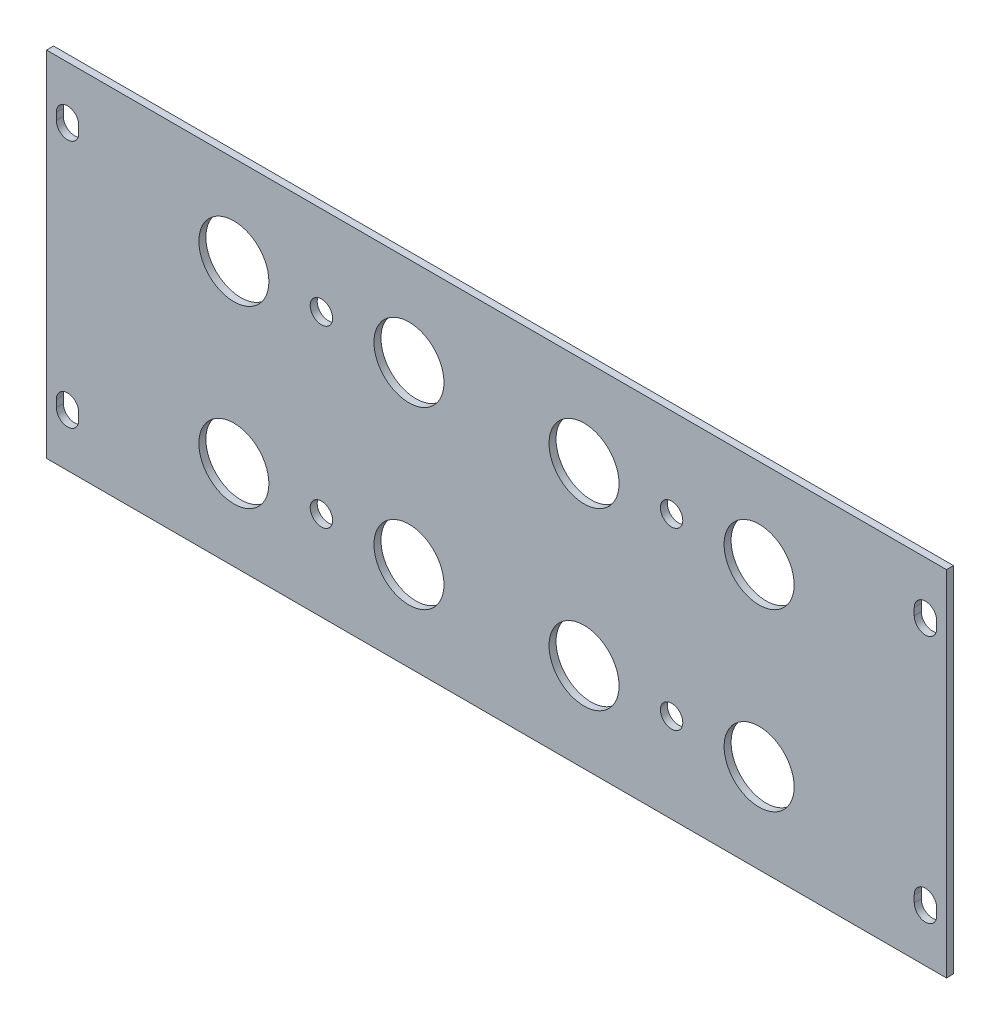
ISO-10303-21;
HEADER;
FILE_DESCRIPTION(('STEP AP214'),'2;1');
FILE_NAME('part.step','',(''),(''),'','','');
FILE_SCHEMA(('AUTOMOTIVE_DESIGN { 1 0 10303 214 1 1 1 1 }'));
ENDSEC;
DATA;
#1=APPLICATION_CONTEXT('core data for automotive mechanical design processes');
#2=APPLICATION_PROTOCOL_DEFINITION('international standard','automotive_design',2000,#1);
#3=PRODUCT_CONTEXT('',#1,'mechanical');
#4=PRODUCT('Part','Part','',(#3));
#5=PRODUCT_RELATED_PRODUCT_CATEGORY('part','',(#4));
#6=PRODUCT_DEFINITION_FORMATION('','',#4);
#7=PRODUCT_DEFINITION_CONTEXT('part definition',#1,'design');
#8=PRODUCT_DEFINITION('design','',#6,#7);
#9=PRODUCT_DEFINITION_SHAPE('','',#8);
#10=(LENGTH_UNIT() NAMED_UNIT(*) SI_UNIT(.MILLI.,.METRE.));
#11=(NAMED_UNIT(*) PLANE_ANGLE_UNIT() SI_UNIT($,.RADIAN.));
#12=(NAMED_UNIT(*) SI_UNIT($,.STERADIAN.) SOLID_ANGLE_UNIT());
#13=UNCERTAINTY_MEASURE_WITH_UNIT(LENGTH_MEASURE(1.E-05),#10,'distance_accuracy_value','');
#14=(GEOMETRIC_REPRESENTATION_CONTEXT(3) GLOBAL_UNCERTAINTY_ASSIGNED_CONTEXT((#13)) GLOBAL_UNIT_ASSIGNED_CONTEXT((#10,
#11,#12)) REPRESENTATION_CONTEXT('',''));
#15=CARTESIAN_POINT('',(0.,0.,0.));
#16=DIRECTION('',(0.,0.,1.));
#17=DIRECTION('',(1.,0.,0.));
#18=AXIS2_PLACEMENT_3D('',#15,#16,#17);
#19=CARTESIAN_POINT('',(64.25,0.,1.));
#20=DIRECTION('',(-1.,0.,0.));
#21=DIRECTION('',(0.,0.,1.));
#22=AXIS2_PLACEMENT_3D('',#19,#20,#21);
#23=PLANE('',#22);
#24=DIRECTION('',(0.,1.,0.));
#25=VECTOR('',#24,1.);
#26=CARTESIAN_POINT('',(64.25,0.,0.));
#27=LINE('',#26,#25);
#28=CARTESIAN_POINT('',(64.25,-25.25,0.));
#29=VERTEX_POINT('',#28);
#30=CARTESIAN_POINT('',(64.25,25.25,0.));
#31=VERTEX_POINT('',#30);
#32=EDGE_CURVE('E327',#29,#31,#27,.T.);
#33=ORIENTED_EDGE('',*,*,#32,.T.);
#34=DIRECTION('',(0.,0.,-1.));
#35=VECTOR('',#34,1.);
#36=CARTESIAN_POINT('',(64.25,25.25,1.));
#37=LINE('',#36,#35);
#38=CARTESIAN_POINT('',(64.25,25.25,1.));
#39=VERTEX_POINT('',#38);
#40=EDGE_CURVE('E11',#39,#31,#37,.T.);
#41=ORIENTED_EDGE('',*,*,#40,.F.);
#42=DIRECTION('',(0.,1.,0.));
#43=VECTOR('',#42,1.);
#44=CARTESIAN_POINT('',(64.25,0.,1.));
#45=LINE('',#44,#43);
#46=CARTESIAN_POINT('',(64.25,-25.25,1.));
#47=VERTEX_POINT('',#46);
#48=EDGE_CURVE('E197',#47,#39,#45,.T.);
#49=ORIENTED_EDGE('',*,*,#48,.F.);
#50=DIRECTION('',(0.,0.,-1.));
#51=VECTOR('',#50,1.);
#52=CARTESIAN_POINT('',(64.25,-25.25,1.));
#53=LINE('',#52,#51);
#54=EDGE_CURVE('E338',#47,#29,#53,.T.);
#55=ORIENTED_EDGE('',*,*,#54,.T.);
#56=EDGE_LOOP('',(#33,#41,#49,#55));
#57=FACE_BOUND('',#56,.T.);
#58=ADVANCED_FACE('F43',(#57),#23,.F.);
#59=CARTESIAN_POINT('',(0.,25.25,1.));
#60=DIRECTION('',(0.,-1.,0.));
#61=DIRECTION('',(0.,0.,-1.));
#62=AXIS2_PLACEMENT_3D('',#59,#60,#61);
#63=PLANE('',#62);
#64=DIRECTION('',(-1.,0.,0.));
#65=VECTOR('',#64,1.);
#66=CARTESIAN_POINT('',(0.,25.25,0.));
#67=LINE('',#66,#65);
#68=CARTESIAN_POINT('',(-64.25,25.25,0.));
#69=VERTEX_POINT('',#68);
#70=EDGE_CURVE('E203',#31,#69,#67,.T.);
#71=ORIENTED_EDGE('',*,*,#70,.T.);
#72=DIRECTION('',(0.,0.,-1.));
#73=VECTOR('',#72,1.);
#74=CARTESIAN_POINT('',(-64.25,25.25,1.));
#75=LINE('',#74,#73);
#76=CARTESIAN_POINT('',(-64.25,25.25,1.));
#77=VERTEX_POINT('',#76);
#78=EDGE_CURVE('E54',#77,#69,#75,.T.);
#79=ORIENTED_EDGE('',*,*,#78,.F.);
#80=DIRECTION('',(-1.,0.,0.));
#81=VECTOR('',#80,1.);
#82=CARTESIAN_POINT('',(0.,25.25,1.));
#83=LINE('',#82,#81);
#84=EDGE_CURVE('E191',#39,#77,#83,.T.);
#85=ORIENTED_EDGE('',*,*,#84,.F.);
#86=ORIENTED_EDGE('',*,*,#40,.T.);
#87=EDGE_LOOP('',(#71,#79,#85,#86));
#88=FACE_BOUND('',#87,.T.);
#89=ADVANCED_FACE('F202',(#88),#63,.F.);
#90=CARTESIAN_POINT('',(-64.25,0.,1.));
#91=DIRECTION('',(1.,0.,0.));
#92=DIRECTION('',(0.,0.,-1.));
#93=AXIS2_PLACEMENT_3D('',#90,#91,#92);
#94=PLANE('',#93);
#95=DIRECTION('',(0.,-1.,0.));
#96=VECTOR('',#95,1.);
#97=CARTESIAN_POINT('',(-64.25,0.,0.));
#98=LINE('',#97,#96);
#99=CARTESIAN_POINT('',(-64.25,-25.25,0.));
#100=VERTEX_POINT('',#99);
#101=EDGE_CURVE('E128',#69,#100,#98,.T.);
#102=ORIENTED_EDGE('',*,*,#101,.T.);
#103=DIRECTION('',(0.,0.,-1.));
#104=VECTOR('',#103,1.);
#105=CARTESIAN_POINT('',(-64.25,-25.25,1.));
#106=LINE('',#105,#104);
#107=CARTESIAN_POINT('',(-64.25,-25.25,1.));
#108=VERTEX_POINT('',#107);
#109=EDGE_CURVE('E205',#108,#100,#106,.T.);
#110=ORIENTED_EDGE('',*,*,#109,.F.);
#111=DIRECTION('',(0.,-1.,0.));
#112=VECTOR('',#111,1.);
#113=CARTESIAN_POINT('',(-64.25,0.,1.));
#114=LINE('',#113,#112);
#115=EDGE_CURVE('E195',#77,#108,#114,.T.);
#116=ORIENTED_EDGE('',*,*,#115,.F.);
#117=ORIENTED_EDGE('',*,*,#78,.T.);
#118=EDGE_LOOP('',(#102,#110,#116,#117));
#119=FACE_BOUND('',#118,.T.);
#120=ADVANCED_FACE('F207',(#119),#94,.F.);
#121=CARTESIAN_POINT('',(-61.25,18.25,1.));
#122=DIRECTION('',(0.,0.,-1.));
#123=DIRECTION('',(-1.,0.,0.));
#124=AXIS2_PLACEMENT_3D('',#121,#122,#123);
#125=CYLINDRICAL_SURFACE('',#124,1.6);
#126=CARTESIAN_POINT('',(-61.25,18.25,0.));
#127=DIRECTION('',(0.,0.,1.));
#128=DIRECTION('',(1.,0.,0.));
#129=AXIS2_PLACEMENT_3D('',#126,#127,#128);
#130=CIRCLE('',#129,1.6);
#131=CARTESIAN_POINT('',(-59.65,18.25,0.));
#132=VERTEX_POINT('',#131);
#133=CARTESIAN_POINT('',(-62.85,18.25,0.));
#134=VERTEX_POINT('',#133);
#135=EDGE_CURVE('E279',#132,#134,#130,.T.);
#136=ORIENTED_EDGE('',*,*,#135,.F.);
#137=DIRECTION('',(0.,0.,-1.));
#138=VECTOR('',#137,1.);
#139=CARTESIAN_POINT('',(-59.65,18.25,1.));
#140=LINE('',#139,#138);
#141=CARTESIAN_POINT('',(-59.65,18.25,1.));
#142=VERTEX_POINT('',#141);
#143=EDGE_CURVE('E341',#142,#132,#140,.T.);
#144=ORIENTED_EDGE('',*,*,#143,.F.);
#145=CARTESIAN_POINT('',(-61.25,18.25,1.));
#146=DIRECTION('',(0.,0.,1.));
#147=DIRECTION('',(1.,0.,0.));
#148=AXIS2_PLACEMENT_3D('',#145,#146,#147);
#149=CIRCLE('',#148,1.6);
#150=CARTESIAN_POINT('',(-62.85,18.25,1.));
#151=VERTEX_POINT('',#150);
#152=EDGE_CURVE('E448',#142,#151,#149,.T.);
#153=ORIENTED_EDGE('',*,*,#152,.T.);
#154=DIRECTION('',(0.,0.,-1.));
#155=VECTOR('',#154,1.);
#156=CARTESIAN_POINT('',(-62.85,18.25,1.));
#157=LINE('',#156,#155);
#158=EDGE_CURVE('E344',#151,#134,#157,.T.);
#159=ORIENTED_EDGE('',*,*,#158,.T.);
#160=EDGE_LOOP('',(#136,#144,#153,#159));
#161=FACE_BOUND('',#160,.T.);
#162=ADVANCED_FACE('F566',(#161),#125,.F.);
#163=CARTESIAN_POINT('',(-59.65,0.,1.));
#164=DIRECTION('',(-1.,0.,0.));
#165=DIRECTION('',(0.,0.,1.));
#166=AXIS2_PLACEMENT_3D('',#163,#164,#165);
#167=PLANE('',#166);
#168=DIRECTION('',(0.,1.,0.));
#169=VECTOR('',#168,1.);
#170=CARTESIAN_POINT('',(-59.65,0.,0.));
#171=LINE('',#170,#169);
#172=CARTESIAN_POINT('',(-59.65,17.25,0.));
#173=VERTEX_POINT('',#172);
#174=EDGE_CURVE('E283',#173,#132,#171,.T.);
#175=ORIENTED_EDGE('',*,*,#174,.F.);
#176=DIRECTION('',(0.,0.,-1.));
#177=VECTOR('',#176,1.);
#178=CARTESIAN_POINT('',(-59.65,17.25,1.));
#179=LINE('',#178,#177);
#180=CARTESIAN_POINT('',(-59.65,17.25,1.));
#181=VERTEX_POINT('',#180);
#182=EDGE_CURVE('E351',#181,#173,#179,.T.);
#183=ORIENTED_EDGE('',*,*,#182,.F.);
#184=DIRECTION('',(0.,1.,0.));
#185=VECTOR('',#184,1.);
#186=CARTESIAN_POINT('',(-59.65,0.,1.));
#187=LINE('',#186,#185);
#188=EDGE_CURVE('E452',#181,#142,#187,.T.);
#189=ORIENTED_EDGE('',*,*,#188,.T.);
#190=ORIENTED_EDGE('',*,*,#143,.T.);
#191=EDGE_LOOP('',(#175,#183,#189,#190));
#192=FACE_BOUND('',#191,.T.);
#193=ADVANCED_FACE('F562',(#192),#167,.T.);
#194=CARTESIAN_POINT('',(-61.25,17.25,1.));
#195=DIRECTION('',(0.,0.,-1.));
#196=DIRECTION('',(-1.,0.,0.));
#197=AXIS2_PLACEMENT_3D('',#194,#195,#196);
#198=CYLINDRICAL_SURFACE('',#197,1.6);
#199=CARTESIAN_POINT('',(-61.25,17.25,0.));
#200=DIRECTION('',(0.,0.,1.));
#201=DIRECTION('',(1.,0.,0.));
#202=AXIS2_PLACEMENT_3D('',#199,#200,#201);
#203=CIRCLE('',#202,1.6);
#204=CARTESIAN_POINT('',(-62.85,17.25,0.));
#205=VERTEX_POINT('',#204);
#206=EDGE_CURVE('E287',#205,#173,#203,.T.);
#207=ORIENTED_EDGE('',*,*,#206,.F.);
#208=DIRECTION('',(0.,0.,-1.));
#209=VECTOR('',#208,1.);
#210=CARTESIAN_POINT('',(-62.85,17.25,1.));
#211=LINE('',#210,#209);
#212=CARTESIAN_POINT('',(-62.85,17.25,1.));
#213=VERTEX_POINT('',#212);
#214=EDGE_CURVE('E347',#213,#205,#211,.T.);
#215=ORIENTED_EDGE('',*,*,#214,.F.);
#216=CARTESIAN_POINT('',(-61.25,17.25,1.));
#217=DIRECTION('',(0.,0.,1.));
#218=DIRECTION('',(1.,0.,0.));
#219=AXIS2_PLACEMENT_3D('',#216,#217,#218);
#220=CIRCLE('',#219,1.6);
#221=EDGE_CURVE('E456',#213,#181,#220,.T.);
#222=ORIENTED_EDGE('',*,*,#221,.T.);
#223=ORIENTED_EDGE('',*,*,#182,.T.);
#224=EDGE_LOOP('',(#207,#215,#222,#223));
#225=FACE_BOUND('',#224,.T.);
#226=ADVANCED_FACE('F558',(#225),#198,.F.);
#227=CARTESIAN_POINT('',(-61.25,-17.25,1.));
#228=DIRECTION('',(0.,0.,-1.));
#229=DIRECTION('',(-1.,0.,0.));
#230=AXIS2_PLACEMENT_3D('',#227,#228,#229);
#231=CYLINDRICAL_SURFACE('',#230,1.6);
#232=CARTESIAN_POINT('',(-61.25,-17.25,0.));
#233=DIRECTION('',(0.,0.,1.));
#234=DIRECTION('',(1.,0.,0.));
#235=AXIS2_PLACEMENT_3D('',#232,#233,#234);
#236=CIRCLE('',#235,1.6);
#237=CARTESIAN_POINT('',(-59.65,-17.25,0.));
#238=VERTEX_POINT('',#237);
#239=CARTESIAN_POINT('',(-62.85,-17.25,0.));
#240=VERTEX_POINT('',#239);
#241=EDGE_CURVE('E263',#238,#240,#236,.T.);
#242=ORIENTED_EDGE('',*,*,#241,.F.);
#243=DIRECTION('',(0.,0.,-1.));
#244=VECTOR('',#243,1.);
#245=CARTESIAN_POINT('',(-59.65,-17.25,1.));
#246=LINE('',#245,#244);
#247=CARTESIAN_POINT('',(-59.65,-17.25,1.));
#248=VERTEX_POINT('',#247);
#249=EDGE_CURVE('E348',#248,#238,#246,.T.);
#250=ORIENTED_EDGE('',*,*,#249,.F.);
#251=CARTESIAN_POINT('',(-61.25,-17.25,1.));
#252=DIRECTION('',(0.,0.,1.));
#253=DIRECTION('',(1.,0.,0.));
#254=AXIS2_PLACEMENT_3D('',#251,#252,#253);
#255=CIRCLE('',#254,1.6);
#256=CARTESIAN_POINT('',(-62.85,-17.25,1.));
#257=VERTEX_POINT('',#256);
#258=EDGE_CURVE('E432',#248,#257,#255,.T.);
#259=ORIENTED_EDGE('',*,*,#258,.T.);
#260=DIRECTION('',(0.,0.,-1.));
#261=VECTOR('',#260,1.);
#262=CARTESIAN_POINT('',(-62.85,-17.25,1.));
#263=LINE('',#262,#261);
#264=EDGE_CURVE('E356',#257,#240,#263,.T.);
#265=ORIENTED_EDGE('',*,*,#264,.T.);
#266=EDGE_LOOP('',(#242,#250,#259,#265));
#267=FACE_BOUND('',#266,.T.);
#268=ADVANCED_FACE('F561',(#267),#231,.F.);
#269=CARTESIAN_POINT('',(-59.65,0.,1.));
#270=DIRECTION('',(-1.,0.,0.));
#271=DIRECTION('',(0.,0.,1.));
#272=AXIS2_PLACEMENT_3D('',#269,#270,#271);
#273=PLANE('',#272);
#274=DIRECTION('',(0.,1.,0.));
#275=VECTOR('',#274,1.);
#276=CARTESIAN_POINT('',(-59.65,0.,0.));
#277=LINE('',#276,#275);
#278=CARTESIAN_POINT('',(-59.65,-18.25,0.));
#279=VERTEX_POINT('',#278);
#280=EDGE_CURVE('E267',#279,#238,#277,.T.);
#281=ORIENTED_EDGE('',*,*,#280,.F.);
#282=DIRECTION('',(0.,0.,-1.));
#283=VECTOR('',#282,1.);
#284=CARTESIAN_POINT('',(-59.65,-18.25,1.));
#285=LINE('',#284,#283);
#286=CARTESIAN_POINT('',(-59.65,-18.25,1.));
#287=VERTEX_POINT('',#286);
#288=EDGE_CURVE('E363',#287,#279,#285,.T.);
#289=ORIENTED_EDGE('',*,*,#288,.F.);
#290=DIRECTION('',(0.,1.,0.));
#291=VECTOR('',#290,1.);
#292=CARTESIAN_POINT('',(-59.65,0.,1.));
#293=LINE('',#292,#291);
#294=EDGE_CURVE('E436',#287,#248,#293,.T.);
#295=ORIENTED_EDGE('',*,*,#294,.T.);
#296=ORIENTED_EDGE('',*,*,#249,.T.);
#297=EDGE_LOOP('',(#281,#289,#295,#296));
#298=FACE_BOUND('',#297,.T.);
#299=ADVANCED_FACE('F579',(#298),#273,.T.);
#300=CARTESIAN_POINT('',(-61.25,-18.25,1.));
#301=DIRECTION('',(0.,0.,-1.));
#302=DIRECTION('',(-1.,0.,0.));
#303=AXIS2_PLACEMENT_3D('',#300,#301,#302);
#304=CYLINDRICAL_SURFACE('',#303,1.6);
#305=CARTESIAN_POINT('',(-61.25,-18.25,0.));
#306=DIRECTION('',(0.,0.,1.));
#307=DIRECTION('',(1.,0.,0.));
#308=AXIS2_PLACEMENT_3D('',#305,#306,#307);
#309=CIRCLE('',#308,1.6);
#310=CARTESIAN_POINT('',(-62.85,-18.25,0.));
#311=VERTEX_POINT('',#310);
#312=EDGE_CURVE('E271',#311,#279,#309,.T.);
#313=ORIENTED_EDGE('',*,*,#312,.F.);
#314=DIRECTION('',(0.,0.,-1.));
#315=VECTOR('',#314,1.);
#316=CARTESIAN_POINT('',(-62.85,-18.25,1.));
#317=LINE('',#316,#315);
#318=CARTESIAN_POINT('',(-62.85,-18.25,1.));
#319=VERTEX_POINT('',#318);
#320=EDGE_CURVE('E359',#319,#311,#317,.T.);
#321=ORIENTED_EDGE('',*,*,#320,.F.);
#322=CARTESIAN_POINT('',(-61.25,-18.25,1.));
#323=DIRECTION('',(0.,0.,1.));
#324=DIRECTION('',(1.,0.,0.));
#325=AXIS2_PLACEMENT_3D('',#322,#323,#324);
#326=CIRCLE('',#325,1.6);
#327=EDGE_CURVE('E440',#319,#287,#326,.T.);
#328=ORIENTED_EDGE('',*,*,#327,.T.);
#329=ORIENTED_EDGE('',*,*,#288,.T.);
#330=EDGE_LOOP('',(#313,#321,#328,#329));
#331=FACE_BOUND('',#330,.T.);
#332=ADVANCED_FACE('F575',(#331),#304,.F.);
#333=CARTESIAN_POINT('',(61.25,17.25,1.));
#334=DIRECTION('',(0.,0.,-1.));
#335=DIRECTION('',(-1.,0.,0.));
#336=AXIS2_PLACEMENT_3D('',#333,#334,#335);
#337=CYLINDRICAL_SURFACE('',#336,1.6);
#338=CARTESIAN_POINT('',(61.25,17.25,0.));
#339=DIRECTION('',(0.,0.,1.));
#340=DIRECTION('',(1.,0.,0.));
#341=AXIS2_PLACEMENT_3D('',#338,#339,#340);
#342=CIRCLE('',#341,1.6);
#343=CARTESIAN_POINT('',(59.65,17.25,0.));
#344=VERTEX_POINT('',#343);
#345=CARTESIAN_POINT('',(62.85,17.25,0.));
#346=VERTEX_POINT('',#345);
#347=EDGE_CURVE('E247',#344,#346,#342,.T.);
#348=ORIENTED_EDGE('',*,*,#347,.F.);
#349=DIRECTION('',(0.,0.,-1.));
#350=VECTOR('',#349,1.);
#351=CARTESIAN_POINT('',(59.65,17.25,1.));
#352=LINE('',#351,#350);
#353=CARTESIAN_POINT('',(59.65,17.25,1.));
#354=VERTEX_POINT('',#353);
#355=EDGE_CURVE('E360',#354,#344,#352,.T.);
#356=ORIENTED_EDGE('',*,*,#355,.F.);
#357=CARTESIAN_POINT('',(61.25,17.25,1.));
#358=DIRECTION('',(0.,0.,1.));
#359=DIRECTION('',(1.,0.,0.));
#360=AXIS2_PLACEMENT_3D('',#357,#358,#359);
#361=CIRCLE('',#360,1.6);
#362=CARTESIAN_POINT('',(62.85,17.25,1.));
#363=VERTEX_POINT('',#362);
#364=EDGE_CURVE('E413',#354,#363,#361,.T.);
#365=ORIENTED_EDGE('',*,*,#364,.T.);
#366=DIRECTION('',(0.,0.,-1.));
#367=VECTOR('',#366,1.);
#368=CARTESIAN_POINT('',(62.85,17.25,1.));
#369=LINE('',#368,#367);
#370=EDGE_CURVE('E368',#363,#346,#369,.T.);
#371=ORIENTED_EDGE('',*,*,#370,.T.);
#372=EDGE_LOOP('',(#348,#356,#365,#371));
#373=FACE_BOUND('',#372,.T.);
#374=ADVANCED_FACE('F578',(#373),#337,.F.);
#375=CARTESIAN_POINT('',(59.65,0.,1.));
#376=DIRECTION('',(1.,0.,0.));
#377=DIRECTION('',(0.,0.,-1.));
#378=AXIS2_PLACEMENT_3D('',#375,#376,#377);
#379=PLANE('',#378);
#380=DIRECTION('',(0.,-1.,0.));
#381=VECTOR('',#380,1.);
#382=CARTESIAN_POINT('',(59.65,0.,0.));
#383=LINE('',#382,#381);
#384=CARTESIAN_POINT('',(59.65,18.25,0.));
#385=VERTEX_POINT('',#384);
#386=EDGE_CURVE('E251',#385,#344,#383,.T.);
#387=ORIENTED_EDGE('',*,*,#386,.F.);
#388=DIRECTION('',(0.,0.,-1.));
#389=VECTOR('',#388,1.);
#390=CARTESIAN_POINT('',(59.65,18.25,1.));
#391=LINE('',#390,#389);
#392=CARTESIAN_POINT('',(59.65,18.25,1.));
#393=VERTEX_POINT('',#392);
#394=EDGE_CURVE('E374',#393,#385,#391,.T.);
#395=ORIENTED_EDGE('',*,*,#394,.F.);
#396=DIRECTION('',(0.,-1.,0.));
#397=VECTOR('',#396,1.);
#398=CARTESIAN_POINT('',(59.65,0.,1.));
#399=LINE('',#398,#397);
#400=EDGE_CURVE('E417',#393,#354,#399,.T.);
#401=ORIENTED_EDGE('',*,*,#400,.T.);
#402=ORIENTED_EDGE('',*,*,#355,.T.);
#403=EDGE_LOOP('',(#387,#395,#401,#402));
#404=FACE_BOUND('',#403,.T.);
#405=ADVANCED_FACE('F593',(#404),#379,.T.);
#406=CARTESIAN_POINT('',(61.25,18.25,1.));
#407=DIRECTION('',(0.,0.,-1.));
#408=DIRECTION('',(-1.,0.,0.));
#409=AXIS2_PLACEMENT_3D('',#406,#407,#408);
#410=CYLINDRICAL_SURFACE('',#409,1.6);
#411=CARTESIAN_POINT('',(61.25,18.25,0.));
#412=DIRECTION('',(0.,0.,1.));
#413=DIRECTION('',(1.,0.,0.));
#414=AXIS2_PLACEMENT_3D('',#411,#412,#413);
#415=CIRCLE('',#414,1.6);
#416=CARTESIAN_POINT('',(62.85,18.25,0.));
#417=VERTEX_POINT('',#416);
#418=EDGE_CURVE('E255',#417,#385,#415,.T.);
#419=ORIENTED_EDGE('',*,*,#418,.F.);
#420=DIRECTION('',(0.,0.,-1.));
#421=VECTOR('',#420,1.);
#422=CARTESIAN_POINT('',(62.85,18.25,1.));
#423=LINE('',#422,#421);
#424=CARTESIAN_POINT('',(62.85,18.25,1.));
#425=VERTEX_POINT('',#424);
#426=EDGE_CURVE('E371',#425,#417,#423,.T.);
#427=ORIENTED_EDGE('',*,*,#426,.F.);
#428=CARTESIAN_POINT('',(61.25,18.25,1.));
#429=DIRECTION('',(0.,0.,1.));
#430=DIRECTION('',(1.,0.,0.));
#431=AXIS2_PLACEMENT_3D('',#428,#429,#430);
#432=CIRCLE('',#431,1.6);
#433=EDGE_CURVE('E424',#425,#393,#432,.T.);
#434=ORIENTED_EDGE('',*,*,#433,.T.);
#435=ORIENTED_EDGE('',*,*,#394,.T.);
#436=EDGE_LOOP('',(#419,#427,#434,#435));
#437=FACE_BOUND('',#436,.T.);
#438=ADVANCED_FACE('F590',(#437),#410,.F.);
#439=CARTESIAN_POINT('',(61.25,-17.25,1.));
#440=DIRECTION('',(0.,0.,-1.));
#441=DIRECTION('',(-1.,0.,0.));
#442=AXIS2_PLACEMENT_3D('',#439,#440,#441);
#443=CYLINDRICAL_SURFACE('',#442,1.6);
#444=CARTESIAN_POINT('',(61.25,-17.25,0.));
#445=DIRECTION('',(0.,0.,1.));
#446=DIRECTION('',(1.,0.,0.));
#447=AXIS2_PLACEMENT_3D('',#444,#445,#446);
#448=CIRCLE('',#447,1.6);
#449=CARTESIAN_POINT('',(62.85,-17.25,0.));
#450=VERTEX_POINT('',#449);
#451=CARTESIAN_POINT('',(59.65,-17.25,0.));
#452=VERTEX_POINT('',#451);
#453=EDGE_CURVE('E231',#450,#452,#448,.T.);
#454=ORIENTED_EDGE('',*,*,#453,.F.);
#455=DIRECTION('',(0.,0.,-1.));
#456=VECTOR('',#455,1.);
#457=CARTESIAN_POINT('',(62.85,-17.25,1.));
#458=LINE('',#457,#456);
#459=CARTESIAN_POINT('',(62.85,-17.25,1.));
#460=VERTEX_POINT('',#459);
#461=EDGE_CURVE('E47',#460,#450,#458,.T.);
#462=ORIENTED_EDGE('',*,*,#461,.F.);
#463=CARTESIAN_POINT('',(61.25,-17.25,1.));
#464=DIRECTION('',(0.,0.,1.));
#465=DIRECTION('',(1.,0.,0.));
#466=AXIS2_PLACEMENT_3D('',#463,#464,#465);
#467=CIRCLE('',#466,1.6);
#468=CARTESIAN_POINT('',(59.65,-17.25,1.));
#469=VERTEX_POINT('',#468);
#470=EDGE_CURVE('E649',#460,#469,#467,.T.);
#471=ORIENTED_EDGE('',*,*,#470,.T.);
#472=DIRECTION('',(0.,0.,-1.));
#473=VECTOR('',#472,1.);
#474=CARTESIAN_POINT('',(59.65,-17.25,1.));
#475=LINE('',#474,#473);
#476=EDGE_CURVE('E211',#469,#452,#475,.T.);
#477=ORIENTED_EDGE('',*,*,#476,.T.);
#478=EDGE_LOOP('',(#454,#462,#471,#477));
#479=FACE_BOUND('',#478,.T.);
#480=ADVANCED_FACE('F395',(#479),#443,.F.);
#481=CARTESIAN_POINT('',(62.85,0.,1.));
#482=DIRECTION('',(-1.,0.,0.));
#483=DIRECTION('',(0.,0.,1.));
#484=AXIS2_PLACEMENT_3D('',#481,#482,#483);
#485=PLANE('',#484);
#486=DIRECTION('',(0.,1.,0.));
#487=VECTOR('',#486,1.);
#488=CARTESIAN_POINT('',(62.85,0.,0.));
#489=LINE('',#488,#487);
#490=CARTESIAN_POINT('',(62.85,-18.25,0.));
#491=VERTEX_POINT('',#490);
#492=EDGE_CURVE('E235',#491,#450,#489,.T.);
#493=ORIENTED_EDGE('',*,*,#492,.F.);
#494=DIRECTION('',(0.,0.,-1.));
#495=VECTOR('',#494,1.);
#496=CARTESIAN_POINT('',(62.85,-18.25,1.));
#497=LINE('',#496,#495);
#498=CARTESIAN_POINT('',(62.85,-18.25,1.));
#499=VERTEX_POINT('',#498);
#500=EDGE_CURVE('E383',#499,#491,#497,.T.);
#501=ORIENTED_EDGE('',*,*,#500,.F.);
#502=DIRECTION('',(0.,1.,0.));
#503=VECTOR('',#502,1.);
#504=CARTESIAN_POINT('',(62.85,0.,1.));
#505=LINE('',#504,#503);
#506=EDGE_CURVE('E394',#499,#460,#505,.T.);
#507=ORIENTED_EDGE('',*,*,#506,.T.);
#508=ORIENTED_EDGE('',*,*,#461,.T.);
#509=EDGE_LOOP('',(#493,#501,#507,#508));
#510=FACE_BOUND('',#509,.T.);
#511=ADVANCED_FACE('F392',(#510),#485,.T.);
#512=CARTESIAN_POINT('',(61.25,-18.25,1.));
#513=DIRECTION('',(0.,0.,-1.));
#514=DIRECTION('',(-1.,0.,0.));
#515=AXIS2_PLACEMENT_3D('',#512,#513,#514);
#516=CYLINDRICAL_SURFACE('',#515,1.6);
#517=CARTESIAN_POINT('',(61.25,-18.25,0.));
#518=DIRECTION('',(0.,0.,1.));
#519=DIRECTION('',(1.,0.,0.));
#520=AXIS2_PLACEMENT_3D('',#517,#518,#519);
#521=CIRCLE('',#520,1.6);
#522=CARTESIAN_POINT('',(59.65,-18.25,0.));
#523=VERTEX_POINT('',#522);
#524=EDGE_CURVE('E239',#523,#491,#521,.T.);
#525=ORIENTED_EDGE('',*,*,#524,.F.);
#526=DIRECTION('',(0.,0.,-1.));
#527=VECTOR('',#526,1.);
#528=CARTESIAN_POINT('',(59.65,-18.25,1.));
#529=LINE('',#528,#527);
#530=CARTESIAN_POINT('',(59.65,-18.25,1.));
#531=VERTEX_POINT('',#530);
#532=EDGE_CURVE('E381',#531,#523,#529,.T.);
#533=ORIENTED_EDGE('',*,*,#532,.F.);
#534=CARTESIAN_POINT('',(61.25,-18.25,1.));
#535=DIRECTION('',(0.,0.,1.));
#536=DIRECTION('',(1.,0.,0.));
#537=AXIS2_PLACEMENT_3D('',#534,#535,#536);
#538=CIRCLE('',#537,1.6);
#539=EDGE_CURVE('E402',#531,#499,#538,.T.);
#540=ORIENTED_EDGE('',*,*,#539,.T.);
#541=ORIENTED_EDGE('',*,*,#500,.T.);
#542=EDGE_LOOP('',(#525,#533,#540,#541));
#543=FACE_BOUND('',#542,.T.);
#544=ADVANCED_FACE('F400',(#543),#516,.F.);
#545=CARTESIAN_POINT('',(-37.5,12.5,1.));
#546=DIRECTION('',(0.,0.,-1.));
#547=DIRECTION('',(-1.,0.,0.));
#548=AXIS2_PLACEMENT_3D('',#545,#546,#547);
#549=CYLINDRICAL_SURFACE('',#548,5.);
#550=CARTESIAN_POINT('',(-37.5,12.5,1.));
#551=DIRECTION('',(0.,0.,1.));
#552=DIRECTION('',(1.,0.,0.));
#553=AXIS2_PLACEMENT_3D('',#550,#551,#552);
#554=CIRCLE('',#553,5.);
#555=CARTESIAN_POINT('',(-32.5,12.5,1.));
#556=VERTEX_POINT('',#555);
#557=EDGE_CURVE('E492',#556,#556,#554,.T.);
#558=ORIENTED_EDGE('',*,*,#557,.T.);
#559=EDGE_LOOP('',(#558));
#560=FACE_BOUND('',#559,.T.);
#561=CARTESIAN_POINT('',(-37.5,12.5,0.));
#562=DIRECTION('',(0.,0.,1.));
#563=DIRECTION('',(1.,0.,0.));
#564=AXIS2_PLACEMENT_3D('',#561,#562,#563);
#565=CIRCLE('',#564,5.);
#566=CARTESIAN_POINT('',(-32.5,12.5,0.));
#567=VERTEX_POINT('',#566);
#568=EDGE_CURVE('E323',#567,#567,#565,.T.);
#569=ORIENTED_EDGE('',*,*,#568,.F.);
#570=EDGE_LOOP('',(#569));
#571=FACE_BOUND('',#570,.T.);
#572=ADVANCED_FACE('F498',(#560,#571),#549,.F.);
#573=CARTESIAN_POINT('',(-12.5,12.5,1.));
#574=DIRECTION('',(0.,0.,-1.));
#575=DIRECTION('',(-1.,0.,0.));
#576=AXIS2_PLACEMENT_3D('',#573,#574,#575);
#577=CYLINDRICAL_SURFACE('',#576,5.);
#578=CARTESIAN_POINT('',(-12.5,12.5,1.));
#579=DIRECTION('',(0.,0.,1.));
#580=DIRECTION('',(1.,0.,0.));
#581=AXIS2_PLACEMENT_3D('',#578,#579,#580);
#582=CIRCLE('',#581,5.);
#583=CARTESIAN_POINT('',(-7.5,12.5,1.));
#584=VERTEX_POINT('',#583);
#585=EDGE_CURVE('E488',#584,#584,#582,.T.);
#586=ORIENTED_EDGE('',*,*,#585,.T.);
#587=EDGE_LOOP('',(#586));
#588=FACE_BOUND('',#587,.T.);
#589=CARTESIAN_POINT('',(-12.5,12.5,0.));
#590=DIRECTION('',(0.,0.,1.));
#591=DIRECTION('',(1.,0.,0.));
#592=AXIS2_PLACEMENT_3D('',#589,#590,#591);
#593=CIRCLE('',#592,5.);
#594=CARTESIAN_POINT('',(-7.5,12.5,0.));
#595=VERTEX_POINT('',#594);
#596=EDGE_CURVE('E319',#595,#595,#593,.T.);
#597=ORIENTED_EDGE('',*,*,#596,.F.);
#598=EDGE_LOOP('',(#597));
#599=FACE_BOUND('',#598,.T.);
#600=ADVANCED_FACE('F525',(#588,#599),#577,.F.);
#601=CARTESIAN_POINT('',(12.5,12.5,1.));
#602=DIRECTION('',(0.,0.,-1.));
#603=DIRECTION('',(-1.,0.,0.));
#604=AXIS2_PLACEMENT_3D('',#601,#602,#603);
#605=CYLINDRICAL_SURFACE('',#604,5.);
#606=CARTESIAN_POINT('',(12.5,12.5,1.));
#607=DIRECTION('',(0.,0.,1.));
#608=DIRECTION('',(1.,0.,0.));
#609=AXIS2_PLACEMENT_3D('',#606,#607,#608);
#610=CIRCLE('',#609,5.);
#611=CARTESIAN_POINT('',(17.5,12.5,1.));
#612=VERTEX_POINT('',#611);
#613=EDGE_CURVE('E484',#612,#612,#610,.T.);
#614=ORIENTED_EDGE('',*,*,#613,.T.);
#615=EDGE_LOOP('',(#614));
#616=FACE_BOUND('',#615,.T.);
#617=CARTESIAN_POINT('',(12.5,12.5,0.));
#618=DIRECTION('',(0.,0.,1.));
#619=DIRECTION('',(1.,0.,0.));
#620=AXIS2_PLACEMENT_3D('',#617,#618,#619);
#621=CIRCLE('',#620,5.);
#622=CARTESIAN_POINT('',(17.5,12.5,0.));
#623=VERTEX_POINT('',#622);
#624=EDGE_CURVE('E315',#623,#623,#621,.T.);
#625=ORIENTED_EDGE('',*,*,#624,.F.);
#626=EDGE_LOOP('',(#625));
#627=FACE_BOUND('',#626,.T.);
#628=ADVANCED_FACE('F528',(#616,#627),#605,.F.);
#629=CARTESIAN_POINT('',(37.5,12.5,1.));
#630=DIRECTION('',(0.,0.,-1.));
#631=DIRECTION('',(-1.,0.,0.));
#632=AXIS2_PLACEMENT_3D('',#629,#630,#631);
#633=CYLINDRICAL_SURFACE('',#632,5.);
#634=CARTESIAN_POINT('',(37.5,12.5,1.));
#635=DIRECTION('',(0.,0.,1.));
#636=DIRECTION('',(1.,0.,0.));
#637=AXIS2_PLACEMENT_3D('',#634,#635,#636);
#638=CIRCLE('',#637,5.);
#639=CARTESIAN_POINT('',(42.5,12.5,1.));
#640=VERTEX_POINT('',#639);
#641=EDGE_CURVE('E480',#640,#640,#638,.T.);
#642=ORIENTED_EDGE('',*,*,#641,.T.);
#643=EDGE_LOOP('',(#642));
#644=FACE_BOUND('',#643,.T.);
#645=CARTESIAN_POINT('',(37.5,12.5,0.));
#646=DIRECTION('',(0.,0.,1.));
#647=DIRECTION('',(1.,0.,0.));
#648=AXIS2_PLACEMENT_3D('',#645,#646,#647);
#649=CIRCLE('',#648,5.);
#650=CARTESIAN_POINT('',(42.5,12.5,0.));
#651=VERTEX_POINT('',#650);
#652=EDGE_CURVE('E311',#651,#651,#649,.T.);
#653=ORIENTED_EDGE('',*,*,#652,.F.);
#654=EDGE_LOOP('',(#653));
#655=FACE_BOUND('',#654,.T.);
#656=ADVANCED_FACE('F532',(#644,#655),#633,.F.);
#657=CARTESIAN_POINT('',(37.5,-12.5,1.));
#658=DIRECTION('',(0.,0.,-1.));
#659=DIRECTION('',(-1.,0.,0.));
#660=AXIS2_PLACEMENT_3D('',#657,#658,#659);
#661=CYLINDRICAL_SURFACE('',#660,5.);
#662=CARTESIAN_POINT('',(37.5,-12.5,1.));
#663=DIRECTION('',(0.,0.,1.));
#664=DIRECTION('',(1.,0.,0.));
#665=AXIS2_PLACEMENT_3D('',#662,#663,#664);
#666=CIRCLE('',#665,5.);
#667=CARTESIAN_POINT('',(42.5,-12.5,1.));
#668=VERTEX_POINT('',#667);
#669=EDGE_CURVE('E476',#668,#668,#666,.T.);
#670=ORIENTED_EDGE('',*,*,#669,.T.);
#671=EDGE_LOOP('',(#670));
#672=FACE_BOUND('',#671,.T.);
#673=CARTESIAN_POINT('',(37.5,-12.5,0.));
#674=DIRECTION('',(0.,0.,1.));
#675=DIRECTION('',(1.,0.,0.));
#676=AXIS2_PLACEMENT_3D('',#673,#674,#675);
#677=CIRCLE('',#676,5.);
#678=CARTESIAN_POINT('',(42.5,-12.5,0.));
#679=VERTEX_POINT('',#678);
#680=EDGE_CURVE('E307',#679,#679,#677,.T.);
#681=ORIENTED_EDGE('',*,*,#680,.F.);
#682=EDGE_LOOP('',(#681));
#683=FACE_BOUND('',#682,.T.);
#684=ADVANCED_FACE('F536',(#672,#683),#661,.F.);
#685=CARTESIAN_POINT('',(-12.5,-12.5,1.));
#686=DIRECTION('',(0.,0.,-1.));
#687=DIRECTION('',(-1.,0.,0.));
#688=AXIS2_PLACEMENT_3D('',#685,#686,#687);
#689=CYLINDRICAL_SURFACE('',#688,5.);
#690=CARTESIAN_POINT('',(-12.5,-12.5,1.));
#691=DIRECTION('',(0.,0.,1.));
#692=DIRECTION('',(1.,0.,0.));
#693=AXIS2_PLACEMENT_3D('',#690,#691,#692);
#694=CIRCLE('',#693,5.);
#695=CARTESIAN_POINT('',(-7.5,-12.5,1.));
#696=VERTEX_POINT('',#695);
#697=EDGE_CURVE('E472',#696,#696,#694,.T.);
#698=ORIENTED_EDGE('',*,*,#697,.T.);
#699=EDGE_LOOP('',(#698));
#700=FACE_BOUND('',#699,.T.);
#701=CARTESIAN_POINT('',(-12.5,-12.5,0.));
#702=DIRECTION('',(0.,0.,1.));
#703=DIRECTION('',(1.,0.,0.));
#704=AXIS2_PLACEMENT_3D('',#701,#702,#703);
#705=CIRCLE('',#704,5.);
#706=CARTESIAN_POINT('',(-7.5,-12.5,0.));
#707=VERTEX_POINT('',#706);
#708=EDGE_CURVE('E303',#707,#707,#705,.T.);
#709=ORIENTED_EDGE('',*,*,#708,.F.);
#710=EDGE_LOOP('',(#709));
#711=FACE_BOUND('',#710,.T.);
#712=ADVANCED_FACE('F540',(#700,#711),#689,.F.);
#713=CARTESIAN_POINT('',(-37.5,-12.5,1.));
#714=DIRECTION('',(0.,0.,-1.));
#715=DIRECTION('',(-1.,0.,0.));
#716=AXIS2_PLACEMENT_3D('',#713,#714,#715);
#717=CYLINDRICAL_SURFACE('',#716,5.);
#718=CARTESIAN_POINT('',(-37.5,-12.5,1.));
#719=DIRECTION('',(0.,0.,1.));
#720=DIRECTION('',(1.,0.,0.));
#721=AXIS2_PLACEMENT_3D('',#718,#719,#720);
#722=CIRCLE('',#721,5.);
#723=CARTESIAN_POINT('',(-32.5,-12.5,1.));
#724=VERTEX_POINT('',#723);
#725=EDGE_CURVE('E468',#724,#724,#722,.T.);
#726=ORIENTED_EDGE('',*,*,#725,.T.);
#727=EDGE_LOOP('',(#726));
#728=FACE_BOUND('',#727,.T.);
#729=CARTESIAN_POINT('',(-37.5,-12.5,0.));
#730=DIRECTION('',(0.,0.,1.));
#731=DIRECTION('',(1.,0.,0.));
#732=AXIS2_PLACEMENT_3D('',#729,#730,#731);
#733=CIRCLE('',#732,5.);
#734=CARTESIAN_POINT('',(-32.5,-12.5,0.));
#735=VERTEX_POINT('',#734);
#736=EDGE_CURVE('E299',#735,#735,#733,.T.);
#737=ORIENTED_EDGE('',*,*,#736,.F.);
#738=EDGE_LOOP('',(#737));
#739=FACE_BOUND('',#738,.T.);
#740=ADVANCED_FACE('F544',(#728,#739),#717,.F.);
#741=CARTESIAN_POINT('',(12.5,-12.5,1.));
#742=DIRECTION('',(0.,0.,-1.));
#743=DIRECTION('',(-1.,0.,0.));
#744=AXIS2_PLACEMENT_3D('',#741,#742,#743);
#745=CYLINDRICAL_SURFACE('',#744,5.);
#746=CARTESIAN_POINT('',(12.5,-12.5,1.));
#747=DIRECTION('',(0.,0.,1.));
#748=DIRECTION('',(1.,0.,0.));
#749=AXIS2_PLACEMENT_3D('',#746,#747,#748);
#750=CIRCLE('',#749,5.);
#751=CARTESIAN_POINT('',(17.5,-12.5,1.));
#752=VERTEX_POINT('',#751);
#753=EDGE_CURVE('E464',#752,#752,#750,.T.);
#754=ORIENTED_EDGE('',*,*,#753,.T.);
#755=EDGE_LOOP('',(#754));
#756=FACE_BOUND('',#755,.T.);
#757=CARTESIAN_POINT('',(12.5,-12.5,0.));
#758=DIRECTION('',(0.,0.,1.));
#759=DIRECTION('',(1.,0.,0.));
#760=AXIS2_PLACEMENT_3D('',#757,#758,#759);
#761=CIRCLE('',#760,5.);
#762=CARTESIAN_POINT('',(17.5,-12.5,0.));
#763=VERTEX_POINT('',#762);
#764=EDGE_CURVE('E295',#763,#763,#761,.T.);
#765=ORIENTED_EDGE('',*,*,#764,.F.);
#766=EDGE_LOOP('',(#765));
#767=FACE_BOUND('',#766,.T.);
#768=ADVANCED_FACE('F548',(#756,#767),#745,.F.);
#769=CARTESIAN_POINT('',(-62.85,0.,1.));
#770=DIRECTION('',(1.,0.,0.));
#771=DIRECTION('',(0.,0.,-1.));
#772=AXIS2_PLACEMENT_3D('',#769,#770,#771);
#773=PLANE('',#772);
#774=DIRECTION('',(0.,-1.,0.));
#775=VECTOR('',#774,1.);
#776=CARTESIAN_POINT('',(-62.85,0.,0.));
#777=LINE('',#776,#775);
#778=EDGE_CURVE('E291',#134,#205,#777,.T.);
#779=ORIENTED_EDGE('',*,*,#778,.F.);
#780=ORIENTED_EDGE('',*,*,#158,.F.);
#781=DIRECTION('',(0.,-1.,0.));
#782=VECTOR('',#781,1.);
#783=CARTESIAN_POINT('',(-62.85,0.,1.));
#784=LINE('',#783,#782);
#785=EDGE_CURVE('E460',#151,#213,#784,.T.);
#786=ORIENTED_EDGE('',*,*,#785,.T.);
#787=ORIENTED_EDGE('',*,*,#214,.T.);
#788=EDGE_LOOP('',(#779,#780,#786,#787));
#789=FACE_BOUND('',#788,.T.);
#790=ADVANCED_FACE('F552',(#789),#773,.T.);
#791=CARTESIAN_POINT('',(-62.85,0.,1.));
#792=DIRECTION('',(1.,0.,0.));
#793=DIRECTION('',(0.,0.,-1.));
#794=AXIS2_PLACEMENT_3D('',#791,#792,#793);
#795=PLANE('',#794);
#796=DIRECTION('',(0.,-1.,0.));
#797=VECTOR('',#796,1.);
#798=CARTESIAN_POINT('',(-62.85,0.,0.));
#799=LINE('',#798,#797);
#800=EDGE_CURVE('E275',#240,#311,#799,.T.);
#801=ORIENTED_EDGE('',*,*,#800,.F.);
#802=ORIENTED_EDGE('',*,*,#264,.F.);
#803=DIRECTION('',(0.,-1.,0.));
#804=VECTOR('',#803,1.);
#805=CARTESIAN_POINT('',(-62.85,0.,1.));
#806=LINE('',#805,#804);
#807=EDGE_CURVE('E444',#257,#319,#806,.T.);
#808=ORIENTED_EDGE('',*,*,#807,.T.);
#809=ORIENTED_EDGE('',*,*,#320,.T.);
#810=EDGE_LOOP('',(#801,#802,#808,#809));
#811=FACE_BOUND('',#810,.T.);
#812=ADVANCED_FACE('F556',(#811),#795,.T.);
#813=CARTESIAN_POINT('',(62.85,0.,1.));
#814=DIRECTION('',(-1.,0.,0.));
#815=DIRECTION('',(0.,0.,1.));
#816=AXIS2_PLACEMENT_3D('',#813,#814,#815);
#817=PLANE('',#816);
#818=DIRECTION('',(0.,1.,0.));
#819=VECTOR('',#818,1.);
#820=CARTESIAN_POINT('',(62.85,0.,0.));
#821=LINE('',#820,#819);
#822=EDGE_CURVE('E259',#346,#417,#821,.T.);
#823=ORIENTED_EDGE('',*,*,#822,.F.);
#824=ORIENTED_EDGE('',*,*,#370,.F.);
#825=DIRECTION('',(0.,1.,0.));
#826=VECTOR('',#825,1.);
#827=CARTESIAN_POINT('',(62.85,0.,1.));
#828=LINE('',#827,#826);
#829=EDGE_CURVE('E428',#363,#425,#828,.T.);
#830=ORIENTED_EDGE('',*,*,#829,.T.);
#831=ORIENTED_EDGE('',*,*,#426,.T.);
#832=EDGE_LOOP('',(#823,#824,#830,#831));
#833=FACE_BOUND('',#832,.T.);
#834=ADVANCED_FACE('F573',(#833),#817,.T.);
#835=CARTESIAN_POINT('',(59.65,0.,1.));
#836=DIRECTION('',(1.,0.,0.));
#837=DIRECTION('',(0.,0.,-1.));
#838=AXIS2_PLACEMENT_3D('',#835,#836,#837);
#839=PLANE('',#838);
#840=DIRECTION('',(0.,-1.,0.));
#841=VECTOR('',#840,1.);
#842=CARTESIAN_POINT('',(59.65,0.,0.));
#843=LINE('',#842,#841);
#844=EDGE_CURVE('E243',#452,#523,#843,.T.);
#845=ORIENTED_EDGE('',*,*,#844,.F.);
#846=ORIENTED_EDGE('',*,*,#476,.F.);
#847=DIRECTION('',(0.,-1.,0.));
#848=VECTOR('',#847,1.);
#849=CARTESIAN_POINT('',(59.65,0.,1.));
#850=LINE('',#849,#848);
#851=EDGE_CURVE('E408',#469,#531,#850,.T.);
#852=ORIENTED_EDGE('',*,*,#851,.T.);
#853=ORIENTED_EDGE('',*,*,#532,.T.);
#854=EDGE_LOOP('',(#845,#846,#852,#853));
#855=FACE_BOUND('',#854,.T.);
#856=ADVANCED_FACE('F411',(#855),#839,.T.);
#857=CARTESIAN_POINT('',(25.,-12.5,1.));
#858=DIRECTION('',(0.,0.,-1.));
#859=DIRECTION('',(-1.,0.,0.));
#860=AXIS2_PLACEMENT_3D('',#857,#858,#859);
#861=CYLINDRICAL_SURFACE('',#860,1.6);
#862=CARTESIAN_POINT('',(25.,-12.5,1.));
#863=DIRECTION('',(0.,0.,1.));
#864=DIRECTION('',(1.,0.,0.));
#865=AXIS2_PLACEMENT_3D('',#862,#863,#864);
#866=CIRCLE('',#865,1.6);
#867=CARTESIAN_POINT('',(26.6,-12.5,1.));
#868=VERTEX_POINT('',#867);
#869=EDGE_CURVE('E641',#868,#868,#866,.T.);
#870=ORIENTED_EDGE('',*,*,#869,.T.);
#871=EDGE_LOOP('',(#870));
#872=FACE_BOUND('',#871,.T.);
#873=CARTESIAN_POINT('',(25.,-12.5,0.));
#874=DIRECTION('',(0.,0.,1.));
#875=DIRECTION('',(1.,0.,0.));
#876=AXIS2_PLACEMENT_3D('',#873,#874,#875);
#877=CIRCLE('',#876,1.6);
#878=CARTESIAN_POINT('',(26.6,-12.5,0.));
#879=VERTEX_POINT('',#878);
#880=EDGE_CURVE('E227',#879,#879,#877,.T.);
#881=ORIENTED_EDGE('',*,*,#880,.F.);
#882=EDGE_LOOP('',(#881));
#883=FACE_BOUND('',#882,.T.);
#884=ADVANCED_FACE('F603',(#872,#883),#861,.F.);
#885=CARTESIAN_POINT('',(-25.,-12.5,1.));
#886=DIRECTION('',(0.,0.,-1.));
#887=DIRECTION('',(-1.,0.,0.));
#888=AXIS2_PLACEMENT_3D('',#885,#886,#887);
#889=CYLINDRICAL_SURFACE('',#888,1.6);
#890=CARTESIAN_POINT('',(-25.,-12.5,1.));
#891=DIRECTION('',(0.,0.,1.));
#892=DIRECTION('',(1.,0.,0.));
#893=AXIS2_PLACEMENT_3D('',#890,#891,#892);
#894=CIRCLE('',#893,1.6);
#895=CARTESIAN_POINT('',(-23.4,-12.5,1.));
#896=VERTEX_POINT('',#895);
#897=EDGE_CURVE('E636',#896,#896,#894,.T.);
#898=ORIENTED_EDGE('',*,*,#897,.T.);
#899=EDGE_LOOP('',(#898));
#900=FACE_BOUND('',#899,.T.);
#901=CARTESIAN_POINT('',(-25.,-12.5,0.));
#902=DIRECTION('',(0.,0.,1.));
#903=DIRECTION('',(1.,0.,0.));
#904=AXIS2_PLACEMENT_3D('',#901,#902,#903);
#905=CIRCLE('',#904,1.6);
#906=CARTESIAN_POINT('',(-23.4,-12.5,0.));
#907=VERTEX_POINT('',#906);
#908=EDGE_CURVE('E223',#907,#907,#905,.T.);
#909=ORIENTED_EDGE('',*,*,#908,.F.);
#910=EDGE_LOOP('',(#909));
#911=FACE_BOUND('',#910,.T.);
#912=ADVANCED_FACE('F612',(#900,#911),#889,.F.);
#913=CARTESIAN_POINT('',(-25.,12.5,1.));
#914=DIRECTION('',(0.,0.,-1.));
#915=DIRECTION('',(-1.,0.,0.));
#916=AXIS2_PLACEMENT_3D('',#913,#914,#915);
#917=CYLINDRICAL_SURFACE('',#916,1.6);
#918=CARTESIAN_POINT('',(-25.,12.5,1.));
#919=DIRECTION('',(0.,0.,1.));
#920=DIRECTION('',(1.,0.,0.));
#921=AXIS2_PLACEMENT_3D('',#918,#919,#920);
#922=CIRCLE('',#921,1.6);
#923=CARTESIAN_POINT('',(-23.4,12.5,1.));
#924=VERTEX_POINT('',#923);
#925=EDGE_CURVE('E626',#924,#924,#922,.T.);
#926=ORIENTED_EDGE('',*,*,#925,.T.);
#927=EDGE_LOOP('',(#926));
#928=FACE_BOUND('',#927,.T.);
#929=CARTESIAN_POINT('',(-25.,12.5,0.));
#930=DIRECTION('',(0.,0.,1.));
#931=DIRECTION('',(1.,0.,0.));
#932=AXIS2_PLACEMENT_3D('',#929,#930,#931);
#933=CIRCLE('',#932,1.6);
#934=CARTESIAN_POINT('',(-23.4,12.5,0.));
#935=VERTEX_POINT('',#934);
#936=EDGE_CURVE('E219',#935,#935,#933,.T.);
#937=ORIENTED_EDGE('',*,*,#936,.F.);
#938=EDGE_LOOP('',(#937));
#939=FACE_BOUND('',#938,.T.);
#940=ADVANCED_FACE('F615',(#928,#939),#917,.F.);
#941=CARTESIAN_POINT('',(25.,12.5,1.));
#942=DIRECTION('',(0.,0.,-1.));
#943=DIRECTION('',(-1.,0.,0.));
#944=AXIS2_PLACEMENT_3D('',#941,#942,#943);
#945=CYLINDRICAL_SURFACE('',#944,1.6);
#946=CARTESIAN_POINT('',(25.,12.5,1.));
#947=DIRECTION('',(0.,0.,1.));
#948=DIRECTION('',(1.,0.,0.));
#949=AXIS2_PLACEMENT_3D('',#946,#947,#948);
#950=CIRCLE('',#949,1.6);
#951=CARTESIAN_POINT('',(26.6,12.5,1.));
#952=VERTEX_POINT('',#951);
#953=EDGE_CURVE('E337',#952,#952,#950,.T.);
#954=ORIENTED_EDGE('',*,*,#953,.T.);
#955=EDGE_LOOP('',(#954));
#956=FACE_BOUND('',#955,.T.);
#957=CARTESIAN_POINT('',(25.,12.5,0.));
#958=DIRECTION('',(0.,0.,1.));
#959=DIRECTION('',(1.,0.,0.));
#960=AXIS2_PLACEMENT_3D('',#957,#958,#959);
#961=CIRCLE('',#960,1.6);
#962=CARTESIAN_POINT('',(26.6,12.5,0.));
#963=VERTEX_POINT('',#962);
#964=EDGE_CURVE('E215',#963,#963,#961,.T.);
#965=ORIENTED_EDGE('',*,*,#964,.F.);
#966=EDGE_LOOP('',(#965));
#967=FACE_BOUND('',#966,.T.);
#968=ADVANCED_FACE('F45',(#956,#967),#945,.F.);
#969=CARTESIAN_POINT('',(0.,-25.25,1.));
#970=DIRECTION('',(0.,1.,0.));
#971=DIRECTION('',(0.,0.,1.));
#972=AXIS2_PLACEMENT_3D('',#969,#970,#971);
#973=PLANE('',#972);
#974=DIRECTION('',(1.,0.,0.));
#975=VECTOR('',#974,1.);
#976=CARTESIAN_POINT('',(0.,-25.25,0.));
#977=LINE('',#976,#975);
#978=EDGE_CURVE('E134',#100,#29,#977,.T.);
#979=ORIENTED_EDGE('',*,*,#978,.T.);
#980=ORIENTED_EDGE('',*,*,#54,.F.);
#981=DIRECTION('',(1.,0.,0.));
#982=VECTOR('',#981,1.);
#983=CARTESIAN_POINT('',(0.,-25.25,1.));
#984=LINE('',#983,#982);
#985=EDGE_CURVE('E63',#108,#47,#984,.T.);
#986=ORIENTED_EDGE('',*,*,#985,.F.);
#987=ORIENTED_EDGE('',*,*,#109,.T.);
#988=EDGE_LOOP('',(#979,#980,#986,#987));
#989=FACE_BOUND('',#988,.T.);
#990=ADVANCED_FACE('F502',(#989),#973,.F.);
#991=CARTESIAN_POINT('',(0.,0.,1.));
#992=DIRECTION('',(0.,0.,1.));
#993=DIRECTION('',(1.,0.,0.));
#994=AXIS2_PLACEMENT_3D('',#991,#992,#993);
#995=PLANE('',#994);
#996=ORIENTED_EDGE('',*,*,#953,.F.);
#997=EDGE_LOOP('',(#996));
#998=FACE_BOUND('',#997,.T.);
#999=ORIENTED_EDGE('',*,*,#925,.F.);
#1000=EDGE_LOOP('',(#999));
#1001=FACE_BOUND('',#1000,.T.);
#1002=ORIENTED_EDGE('',*,*,#897,.F.);
#1003=EDGE_LOOP('',(#1002));
#1004=FACE_BOUND('',#1003,.T.);
#1005=ORIENTED_EDGE('',*,*,#869,.F.);
#1006=EDGE_LOOP('',(#1005));
#1007=FACE_BOUND('',#1006,.T.);
#1008=ORIENTED_EDGE('',*,*,#470,.F.);
#1009=ORIENTED_EDGE('',*,*,#506,.F.);
#1010=ORIENTED_EDGE('',*,*,#539,.F.);
#1011=ORIENTED_EDGE('',*,*,#851,.F.);
#1012=EDGE_LOOP('',(#1008,#1009,#1010,#1011));
#1013=FACE_BOUND('',#1012,.T.);
#1014=ORIENTED_EDGE('',*,*,#364,.F.);
#1015=ORIENTED_EDGE('',*,*,#400,.F.);
#1016=ORIENTED_EDGE('',*,*,#433,.F.);
#1017=ORIENTED_EDGE('',*,*,#829,.F.);
#1018=EDGE_LOOP('',(#1014,#1015,#1016,#1017));
#1019=FACE_BOUND('',#1018,.T.);
#1020=ORIENTED_EDGE('',*,*,#258,.F.);
#1021=ORIENTED_EDGE('',*,*,#294,.F.);
#1022=ORIENTED_EDGE('',*,*,#327,.F.);
#1023=ORIENTED_EDGE('',*,*,#807,.F.);
#1024=EDGE_LOOP('',(#1020,#1021,#1022,#1023));
#1025=FACE_BOUND('',#1024,.T.);
#1026=ORIENTED_EDGE('',*,*,#152,.F.);
#1027=ORIENTED_EDGE('',*,*,#188,.F.);
#1028=ORIENTED_EDGE('',*,*,#221,.F.);
#1029=ORIENTED_EDGE('',*,*,#785,.F.);
#1030=EDGE_LOOP('',(#1026,#1027,#1028,#1029));
#1031=FACE_BOUND('',#1030,.T.);
#1032=ORIENTED_EDGE('',*,*,#753,.F.);
#1033=EDGE_LOOP('',(#1032));
#1034=FACE_BOUND('',#1033,.T.);
#1035=ORIENTED_EDGE('',*,*,#725,.F.);
#1036=EDGE_LOOP('',(#1035));
#1037=FACE_BOUND('',#1036,.T.);
#1038=ORIENTED_EDGE('',*,*,#697,.F.);
#1039=EDGE_LOOP('',(#1038));
#1040=FACE_BOUND('',#1039,.T.);
#1041=ORIENTED_EDGE('',*,*,#669,.F.);
#1042=EDGE_LOOP('',(#1041));
#1043=FACE_BOUND('',#1042,.T.);
#1044=ORIENTED_EDGE('',*,*,#641,.F.);
#1045=EDGE_LOOP('',(#1044));
#1046=FACE_BOUND('',#1045,.T.);
#1047=ORIENTED_EDGE('',*,*,#613,.F.);
#1048=EDGE_LOOP('',(#1047));
#1049=FACE_BOUND('',#1048,.T.);
#1050=ORIENTED_EDGE('',*,*,#585,.F.);
#1051=EDGE_LOOP('',(#1050));
#1052=FACE_BOUND('',#1051,.T.);
#1053=ORIENTED_EDGE('',*,*,#557,.F.);
#1054=EDGE_LOOP('',(#1053));
#1055=FACE_BOUND('',#1054,.T.);
#1056=ORIENTED_EDGE('',*,*,#48,.T.);
#1057=ORIENTED_EDGE('',*,*,#84,.T.);
#1058=ORIENTED_EDGE('',*,*,#115,.T.);
#1059=ORIENTED_EDGE('',*,*,#985,.T.);
#1060=EDGE_LOOP('',(#1056,#1057,#1058,#1059));
#1061=FACE_BOUND('',#1060,.T.);
#1062=ADVANCED_FACE('F193',(#998,#1001,#1004,#1007,#1013,#1019,#1025,#1031,#1034,#1037,#1040,
#1043,#1046,#1049,#1052,#1055,#1061),#995,.T.);
#1063=CARTESIAN_POINT('',(0.,0.,0.));
#1064=DIRECTION('',(0.,0.,1.));
#1065=DIRECTION('',(1.,0.,0.));
#1066=AXIS2_PLACEMENT_3D('',#1063,#1064,#1065);
#1067=PLANE('',#1066);
#1068=ORIENTED_EDGE('',*,*,#964,.T.);
#1069=EDGE_LOOP('',(#1068));
#1070=FACE_BOUND('',#1069,.T.);
#1071=ORIENTED_EDGE('',*,*,#936,.T.);
#1072=EDGE_LOOP('',(#1071));
#1073=FACE_BOUND('',#1072,.T.);
#1074=ORIENTED_EDGE('',*,*,#908,.T.);
#1075=EDGE_LOOP('',(#1074));
#1076=FACE_BOUND('',#1075,.T.);
#1077=ORIENTED_EDGE('',*,*,#880,.T.);
#1078=EDGE_LOOP('',(#1077));
#1079=FACE_BOUND('',#1078,.T.);
#1080=ORIENTED_EDGE('',*,*,#453,.T.);
#1081=ORIENTED_EDGE('',*,*,#844,.T.);
#1082=ORIENTED_EDGE('',*,*,#524,.T.);
#1083=ORIENTED_EDGE('',*,*,#492,.T.);
#1084=EDGE_LOOP('',(#1080,#1081,#1082,#1083));
#1085=FACE_BOUND('',#1084,.T.);
#1086=ORIENTED_EDGE('',*,*,#347,.T.);
#1087=ORIENTED_EDGE('',*,*,#822,.T.);
#1088=ORIENTED_EDGE('',*,*,#418,.T.);
#1089=ORIENTED_EDGE('',*,*,#386,.T.);
#1090=EDGE_LOOP('',(#1086,#1087,#1088,#1089));
#1091=FACE_BOUND('',#1090,.T.);
#1092=ORIENTED_EDGE('',*,*,#241,.T.);
#1093=ORIENTED_EDGE('',*,*,#800,.T.);
#1094=ORIENTED_EDGE('',*,*,#312,.T.);
#1095=ORIENTED_EDGE('',*,*,#280,.T.);
#1096=EDGE_LOOP('',(#1092,#1093,#1094,#1095));
#1097=FACE_BOUND('',#1096,.T.);
#1098=ORIENTED_EDGE('',*,*,#135,.T.);
#1099=ORIENTED_EDGE('',*,*,#778,.T.);
#1100=ORIENTED_EDGE('',*,*,#206,.T.);
#1101=ORIENTED_EDGE('',*,*,#174,.T.);
#1102=EDGE_LOOP('',(#1098,#1099,#1100,#1101));
#1103=FACE_BOUND('',#1102,.T.);
#1104=ORIENTED_EDGE('',*,*,#764,.T.);
#1105=EDGE_LOOP('',(#1104));
#1106=FACE_BOUND('',#1105,.T.);
#1107=ORIENTED_EDGE('',*,*,#736,.T.);
#1108=EDGE_LOOP('',(#1107));
#1109=FACE_BOUND('',#1108,.T.);
#1110=ORIENTED_EDGE('',*,*,#708,.T.);
#1111=EDGE_LOOP('',(#1110));
#1112=FACE_BOUND('',#1111,.T.);
#1113=ORIENTED_EDGE('',*,*,#680,.T.);
#1114=EDGE_LOOP('',(#1113));
#1115=FACE_BOUND('',#1114,.T.);
#1116=ORIENTED_EDGE('',*,*,#652,.T.);
#1117=EDGE_LOOP('',(#1116));
#1118=FACE_BOUND('',#1117,.T.);
#1119=ORIENTED_EDGE('',*,*,#624,.T.);
#1120=EDGE_LOOP('',(#1119));
#1121=FACE_BOUND('',#1120,.T.);
#1122=ORIENTED_EDGE('',*,*,#596,.T.);
#1123=EDGE_LOOP('',(#1122));
#1124=FACE_BOUND('',#1123,.T.);
#1125=ORIENTED_EDGE('',*,*,#568,.T.);
#1126=EDGE_LOOP('',(#1125));
#1127=FACE_BOUND('',#1126,.T.);
#1128=ORIENTED_EDGE('',*,*,#32,.F.);
#1129=ORIENTED_EDGE('',*,*,#978,.F.);
#1130=ORIENTED_EDGE('',*,*,#101,.F.);
#1131=ORIENTED_EDGE('',*,*,#70,.F.);
#1132=EDGE_LOOP('',(#1128,#1129,#1130,#1131));
#1133=FACE_BOUND('',#1132,.T.);
#1134=ADVANCED_FACE('F398',(#1070,#1073,#1076,#1079,#1085,#1091,#1097,#1103,#1106,#1109,#1112,
#1115,#1118,#1121,#1124,#1127,#1133),#1067,.F.);
#1135=CLOSED_SHELL('',(#58,#89,#120,#162,#193,#226,#268,#299,#332,#374,#405,#438,#480,#511,#544,
#572,#600,#628,#656,#684,#712,#740,#768,#790,#812,#834,#856,#884,#912,#940,#968,#990,#1062,#1134));
#1136=MANIFOLD_SOLID_BREP('B2',#1135);
#1137=ADVANCED_BREP_SHAPE_REPRESENTATION('',(#18,#1136),#14);
#1138=SHAPE_DEFINITION_REPRESENTATION(#9,#1137);
ENDSEC;
END-ISO-10303-21;
